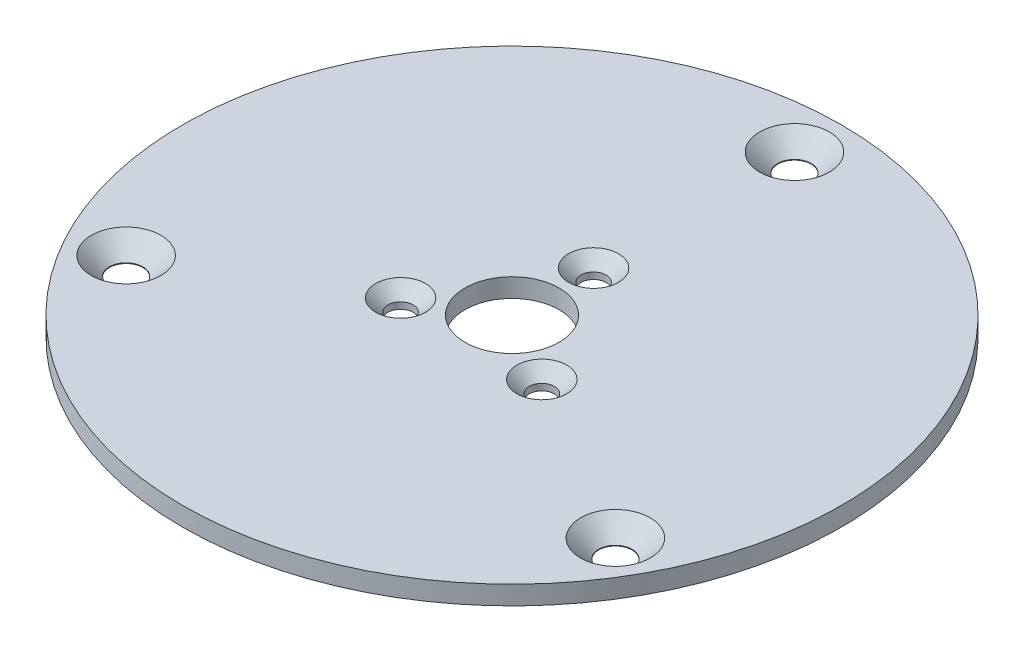
ISO-10303-21;
HEADER;
FILE_DESCRIPTION(('STEP AP214'),'2;1');
FILE_NAME('part.step','',(''),(''),'','','');
FILE_SCHEMA(('AUTOMOTIVE_DESIGN { 1 0 10303 214 1 1 1 1 }'));
ENDSEC;
DATA;
#1=APPLICATION_CONTEXT('core data for automotive mechanical design processes');
#2=APPLICATION_PROTOCOL_DEFINITION('international standard','automotive_design',2000,#1);
#3=PRODUCT_CONTEXT('',#1,'mechanical');
#4=PRODUCT('Part','Part','',(#3));
#5=PRODUCT_RELATED_PRODUCT_CATEGORY('part','',(#4));
#6=PRODUCT_DEFINITION_FORMATION('','',#4);
#7=PRODUCT_DEFINITION_CONTEXT('part definition',#1,'design');
#8=PRODUCT_DEFINITION('design','',#6,#7);
#9=PRODUCT_DEFINITION_SHAPE('','',#8);
#10=(LENGTH_UNIT() NAMED_UNIT(*) SI_UNIT(.MILLI.,.METRE.));
#11=(NAMED_UNIT(*) PLANE_ANGLE_UNIT() SI_UNIT($,.RADIAN.));
#12=(NAMED_UNIT(*) SI_UNIT($,.STERADIAN.) SOLID_ANGLE_UNIT());
#13=UNCERTAINTY_MEASURE_WITH_UNIT(LENGTH_MEASURE(1.E-05),#10,'distance_accuracy_value','');
#14=(GEOMETRIC_REPRESENTATION_CONTEXT(3) GLOBAL_UNCERTAINTY_ASSIGNED_CONTEXT((#13)) GLOBAL_UNIT_ASSIGNED_CONTEXT((#10,
#11,#12)) REPRESENTATION_CONTEXT('',''));
#15=CARTESIAN_POINT('',(0.,0.,0.));
#16=DIRECTION('',(0.,0.,1.));
#17=DIRECTION('',(1.,0.,0.));
#18=AXIS2_PLACEMENT_3D('',#15,#16,#17);
#19=CARTESIAN_POINT('',(0.,2.54,0.));
#20=DIRECTION('',(0.,-1.,0.));
#21=DIRECTION('',(0.,0.,-1.));
#22=AXIS2_PLACEMENT_3D('',#19,#20,#21);
#23=CYLINDRICAL_SURFACE('',#22,44.45);
#24=CARTESIAN_POINT('',(0.,2.54,0.));
#25=DIRECTION('',(0.,1.,0.));
#26=DIRECTION('',(0.,0.,1.));
#27=AXIS2_PLACEMENT_3D('',#24,#25,#26);
#28=CIRCLE('',#27,44.45);
#29=CARTESIAN_POINT('',(0.,2.54,44.45));
#30=VERTEX_POINT('',#29);
#31=EDGE_CURVE('E10',#30,#30,#28,.T.);
#32=ORIENTED_EDGE('',*,*,#31,.F.);
#33=EDGE_LOOP('',(#32));
#34=FACE_BOUND('',#33,.T.);
#35=CARTESIAN_POINT('',(0.,0.,0.));
#36=DIRECTION('',(0.,1.,0.));
#37=DIRECTION('',(0.,0.,1.));
#38=AXIS2_PLACEMENT_3D('',#35,#36,#37);
#39=CIRCLE('',#38,44.45);
#40=CARTESIAN_POINT('',(0.,0.,44.45));
#41=VERTEX_POINT('',#40);
#42=EDGE_CURVE('E39',#41,#41,#39,.T.);
#43=ORIENTED_EDGE('',*,*,#42,.T.);
#44=EDGE_LOOP('',(#43));
#45=FACE_BOUND('',#44,.T.);
#46=ADVANCED_FACE('F36',(#34,#45),#23,.T.);
#47=CARTESIAN_POINT('',(0.,2.54,0.));
#48=DIRECTION('',(0.,1.,0.));
#49=DIRECTION('',(0.,0.,1.));
#50=AXIS2_PLACEMENT_3D('',#47,#48,#49);
#51=PLANE('',#50);
#52=CARTESIAN_POINT('',(0.,2.54,-11.));
#53=DIRECTION('',(0.,1.,0.));
#54=DIRECTION('',(0.,0.,1.));
#55=AXIS2_PLACEMENT_3D('',#52,#53,#54);
#56=CIRCLE('',#55,3.36);
#57=CARTESIAN_POINT('',(0.,2.54,-7.64));
#58=VERTEX_POINT('',#57);
#59=EDGE_CURVE('E120',#58,#58,#56,.T.);
#60=ORIENTED_EDGE('',*,*,#59,.F.);
#61=EDGE_LOOP('',(#60));
#62=FACE_BOUND('',#61,.T.);
#63=CARTESIAN_POINT('',(-9.52627944162882,2.54,5.5));
#64=DIRECTION('',(0.,1.,0.));
#65=DIRECTION('',(0.,0.,1.));
#66=AXIS2_PLACEMENT_3D('',#63,#64,#65);
#67=CIRCLE('',#66,3.36);
#68=CARTESIAN_POINT('',(-9.52627944162882,2.54,8.86));
#69=VERTEX_POINT('',#68);
#70=EDGE_CURVE('E110',#69,#69,#67,.T.);
#71=ORIENTED_EDGE('',*,*,#70,.F.);
#72=EDGE_LOOP('',(#71));
#73=FACE_BOUND('',#72,.T.);
#74=CARTESIAN_POINT('',(9.52627944162882,2.54,5.5));
#75=DIRECTION('',(0.,1.,0.));
#76=DIRECTION('',(0.,0.,1.));
#77=AXIS2_PLACEMENT_3D('',#74,#75,#76);
#78=CIRCLE('',#77,3.36);
#79=CARTESIAN_POINT('',(9.52627944162882,2.54,8.86));
#80=VERTEX_POINT('',#79);
#81=EDGE_CURVE('E98',#80,#80,#78,.T.);
#82=ORIENTED_EDGE('',*,*,#81,.F.);
#83=EDGE_LOOP('',(#82));
#84=FACE_BOUND('',#83,.T.);
#85=CARTESIAN_POINT('',(0.,2.54,0.));
#86=DIRECTION('',(0.,1.,0.));
#87=DIRECTION('',(0.,0.,1.));
#88=AXIS2_PLACEMENT_3D('',#85,#86,#87);
#89=CIRCLE('',#88,6.35);
#90=CARTESIAN_POINT('',(0.,2.54,6.35));
#91=VERTEX_POINT('',#90);
#92=EDGE_CURVE('E83',#91,#91,#89,.T.);
#93=ORIENTED_EDGE('',*,*,#92,.F.);
#94=EDGE_LOOP('',(#93));
#95=FACE_BOUND('',#94,.T.);
#96=CARTESIAN_POINT('',(0.,2.54,-38.1));
#97=DIRECTION('',(0.,1.,0.));
#98=DIRECTION('',(0.,0.,1.));
#99=AXIS2_PLACEMENT_3D('',#96,#97,#98);
#100=CIRCLE('',#99,4.7);
#101=CARTESIAN_POINT('',(0.,2.54,-33.4));
#102=VERTEX_POINT('',#101);
#103=EDGE_CURVE('E79',#102,#102,#100,.T.);
#104=ORIENTED_EDGE('',*,*,#103,.F.);
#105=EDGE_LOOP('',(#104));
#106=FACE_BOUND('',#105,.T.);
#107=CARTESIAN_POINT('',(-32.9955678841873,2.54,19.0499999999997));
#108=DIRECTION('',(0.,1.,0.));
#109=DIRECTION('',(0.,0.,1.));
#110=AXIS2_PLACEMENT_3D('',#107,#108,#109);
#111=CIRCLE('',#110,4.7);
#112=CARTESIAN_POINT('',(-32.9955678841873,2.54,23.7499999999997));
#113=VERTEX_POINT('',#112);
#114=EDGE_CURVE('E69',#113,#113,#111,.T.);
#115=ORIENTED_EDGE('',*,*,#114,.F.);
#116=EDGE_LOOP('',(#115));
#117=FACE_BOUND('',#116,.T.);
#118=CARTESIAN_POINT('',(32.995567884187,2.54,19.0500000000002));
#119=DIRECTION('',(0.,1.,0.));
#120=DIRECTION('',(0.,0.,1.));
#121=AXIS2_PLACEMENT_3D('',#118,#119,#120);
#122=CIRCLE('',#121,4.7);
#123=CARTESIAN_POINT('',(32.995567884187,2.54,23.7500000000001));
#124=VERTEX_POINT('',#123);
#125=EDGE_CURVE('E57',#124,#124,#122,.T.);
#126=ORIENTED_EDGE('',*,*,#125,.F.);
#127=EDGE_LOOP('',(#126));
#128=FACE_BOUND('',#127,.T.);
#129=ORIENTED_EDGE('',*,*,#31,.T.);
#130=EDGE_LOOP('',(#129));
#131=FACE_BOUND('',#130,.T.);
#132=ADVANCED_FACE('F126',(#62,#73,#84,#95,#106,#117,#128,#131),#51,.T.);
#133=CARTESIAN_POINT('',(0.,0.,0.));
#134=DIRECTION('',(0.,1.,0.));
#135=DIRECTION('',(0.,0.,1.));
#136=AXIS2_PLACEMENT_3D('',#133,#134,#135);
#137=PLANE('',#136);
#138=CARTESIAN_POINT('',(0.,0.,-11.));
#139=DIRECTION('',(0.,1.,0.));
#140=DIRECTION('',(0.,0.,1.));
#141=AXIS2_PLACEMENT_3D('',#138,#139,#140);
#142=CIRCLE('',#141,1.7);
#143=CARTESIAN_POINT('',(0.,0.,-9.3));
#144=VERTEX_POINT('',#143);
#145=EDGE_CURVE('E114',#144,#144,#142,.T.);
#146=ORIENTED_EDGE('',*,*,#145,.T.);
#147=EDGE_LOOP('',(#146));
#148=FACE_BOUND('',#147,.T.);
#149=CARTESIAN_POINT('',(-9.52627944162882,0.,5.5));
#150=DIRECTION('',(0.,1.,0.));
#151=DIRECTION('',(0.,0.,1.));
#152=AXIS2_PLACEMENT_3D('',#149,#150,#151);
#153=CIRCLE('',#152,1.7);
#154=CARTESIAN_POINT('',(-9.52627944162882,0.,7.2));
#155=VERTEX_POINT('',#154);
#156=EDGE_CURVE('E102',#155,#155,#153,.T.);
#157=ORIENTED_EDGE('',*,*,#156,.T.);
#158=EDGE_LOOP('',(#157));
#159=FACE_BOUND('',#158,.T.);
#160=CARTESIAN_POINT('',(9.52627944162882,0.,5.5));
#161=DIRECTION('',(0.,1.,0.));
#162=DIRECTION('',(0.,0.,1.));
#163=AXIS2_PLACEMENT_3D('',#160,#161,#162);
#164=CIRCLE('',#163,1.7);
#165=CARTESIAN_POINT('',(9.52627944162882,0.,7.2));
#166=VERTEX_POINT('',#165);
#167=EDGE_CURVE('E87',#166,#166,#164,.T.);
#168=ORIENTED_EDGE('',*,*,#167,.T.);
#169=EDGE_LOOP('',(#168));
#170=FACE_BOUND('',#169,.T.);
#171=CARTESIAN_POINT('',(0.,0.,0.));
#172=DIRECTION('',(0.,1.,0.));
#173=DIRECTION('',(0.,0.,1.));
#174=AXIS2_PLACEMENT_3D('',#171,#172,#173);
#175=CIRCLE('',#174,6.35);
#176=CARTESIAN_POINT('',(0.,0.,6.35));
#177=VERTEX_POINT('',#176);
#178=EDGE_CURVE('E82',#177,#177,#175,.T.);
#179=ORIENTED_EDGE('',*,*,#178,.T.);
#180=EDGE_LOOP('',(#179));
#181=FACE_BOUND('',#180,.T.);
#182=CARTESIAN_POINT('',(0.,0.,-38.1));
#183=DIRECTION('',(0.,1.,0.));
#184=DIRECTION('',(0.,0.,1.));
#185=AXIS2_PLACEMENT_3D('',#182,#183,#184);
#186=CIRCLE('',#185,2.25);
#187=CARTESIAN_POINT('',(0.,0.,-35.85));
#188=VERTEX_POINT('',#187);
#189=EDGE_CURVE('E73',#188,#188,#186,.T.);
#190=ORIENTED_EDGE('',*,*,#189,.T.);
#191=EDGE_LOOP('',(#190));
#192=FACE_BOUND('',#191,.T.);
#193=CARTESIAN_POINT('',(-32.9955678841873,0.,19.0499999999997));
#194=DIRECTION('',(0.,1.,0.));
#195=DIRECTION('',(0.,0.,1.));
#196=AXIS2_PLACEMENT_3D('',#193,#194,#195);
#197=CIRCLE('',#196,2.25);
#198=CARTESIAN_POINT('',(-32.9955678841873,0.,21.2999999999997));
#199=VERTEX_POINT('',#198);
#200=EDGE_CURVE('E61',#199,#199,#197,.T.);
#201=ORIENTED_EDGE('',*,*,#200,.T.);
#202=EDGE_LOOP('',(#201));
#203=FACE_BOUND('',#202,.T.);
#204=CARTESIAN_POINT('',(32.995567884187,0.,19.0500000000002));
#205=DIRECTION('',(0.,1.,0.));
#206=DIRECTION('',(0.,0.,1.));
#207=AXIS2_PLACEMENT_3D('',#204,#205,#206);
#208=CIRCLE('',#207,2.25);
#209=CARTESIAN_POINT('',(32.995567884187,0.,21.3000000000002));
#210=VERTEX_POINT('',#209);
#211=EDGE_CURVE('E48',#210,#210,#208,.T.);
#212=ORIENTED_EDGE('',*,*,#211,.T.);
#213=EDGE_LOOP('',(#212));
#214=FACE_BOUND('',#213,.T.);
#215=ORIENTED_EDGE('',*,*,#42,.F.);
#216=EDGE_LOOP('',(#215));
#217=FACE_BOUND('',#216,.T.);
#218=ADVANCED_FACE('F129',(#148,#159,#170,#181,#192,#203,#214,#217),#137,.F.);
#219=CARTESIAN_POINT('',(32.995567884187,2.54,19.0500000000002));
#220=DIRECTION('',(0.,1.,0.));
#221=DIRECTION('',(0.,0.,1.));
#222=AXIS2_PLACEMENT_3D('',#219,#220,#221);
#223=CYLINDRICAL_SURFACE('',#222,2.25);
#224=ORIENTED_EDGE('',*,*,#211,.F.);
#225=EDGE_LOOP('',(#224));
#226=FACE_BOUND('',#225,.T.);
#227=CARTESIAN_POINT('',(32.995567884187,0.0900000000000002,19.0500000000002));
#228=DIRECTION('',(0.,1.,0.));
#229=DIRECTION('',(0.,0.,1.));
#230=AXIS2_PLACEMENT_3D('',#227,#228,#229);
#231=CIRCLE('',#230,2.25);
#232=CARTESIAN_POINT('',(32.995567884187,0.0900000000000002,21.3000000000002));
#233=VERTEX_POINT('',#232);
#234=EDGE_CURVE('E53',#233,#233,#231,.T.);
#235=ORIENTED_EDGE('',*,*,#234,.T.);
#236=EDGE_LOOP('',(#235));
#237=FACE_BOUND('',#236,.T.);
#238=ADVANCED_FACE('F146',(#226,#237),#223,.F.);
#239=CARTESIAN_POINT('',(32.995567884187,2.54,19.0500000000002));
#240=DIRECTION('',(0.,1.,0.));
#241=DIRECTION('',(0.,0.,1.));
#242=AXIS2_PLACEMENT_3D('',#239,#240,#241);
#243=CONICAL_SURFACE('',#242,4.7,0.785398163397447);
#244=ORIENTED_EDGE('',*,*,#234,.F.);
#245=EDGE_LOOP('',(#244));
#246=FACE_BOUND('',#245,.T.);
#247=ORIENTED_EDGE('',*,*,#125,.T.);
#248=EDGE_LOOP('',(#247));
#249=FACE_BOUND('',#248,.T.);
#250=ADVANCED_FACE('F143',(#246,#249),#243,.F.);
#251=CARTESIAN_POINT('',(-32.9955678841873,2.54,19.0499999999997));
#252=DIRECTION('',(0.,1.,0.));
#253=DIRECTION('',(0.,0.,1.));
#254=AXIS2_PLACEMENT_3D('',#251,#252,#253);
#255=CYLINDRICAL_SURFACE('',#254,2.25);
#256=ORIENTED_EDGE('',*,*,#200,.F.);
#257=EDGE_LOOP('',(#256));
#258=FACE_BOUND('',#257,.T.);
#259=CARTESIAN_POINT('',(-32.9955678841873,0.0900000000000002,19.0499999999997));
#260=DIRECTION('',(0.,1.,0.));
#261=DIRECTION('',(0.,0.,1.));
#262=AXIS2_PLACEMENT_3D('',#259,#260,#261);
#263=CIRCLE('',#262,2.25);
#264=CARTESIAN_POINT('',(-32.9955678841873,0.0900000000000002,21.2999999999997));
#265=VERTEX_POINT('',#264);
#266=EDGE_CURVE('E65',#265,#265,#263,.T.);
#267=ORIENTED_EDGE('',*,*,#266,.T.);
#268=EDGE_LOOP('',(#267));
#269=FACE_BOUND('',#268,.T.);
#270=ADVANCED_FACE('F145',(#258,#269),#255,.F.);
#271=CARTESIAN_POINT('',(-32.9955678841873,2.54,19.0499999999997));
#272=DIRECTION('',(0.,1.,0.));
#273=DIRECTION('',(0.,0.,1.));
#274=AXIS2_PLACEMENT_3D('',#271,#272,#273);
#275=CONICAL_SURFACE('',#274,4.7,0.785398163397448);
#276=ORIENTED_EDGE('',*,*,#266,.F.);
#277=EDGE_LOOP('',(#276));
#278=FACE_BOUND('',#277,.T.);
#279=ORIENTED_EDGE('',*,*,#114,.T.);
#280=EDGE_LOOP('',(#279));
#281=FACE_BOUND('',#280,.T.);
#282=ADVANCED_FACE('F153',(#278,#281),#275,.F.);
#283=CARTESIAN_POINT('',(0.,2.54,-38.1));
#284=DIRECTION('',(0.,1.,0.));
#285=DIRECTION('',(0.,0.,1.));
#286=AXIS2_PLACEMENT_3D('',#283,#284,#285);
#287=CYLINDRICAL_SURFACE('',#286,2.25);
#288=ORIENTED_EDGE('',*,*,#189,.F.);
#289=EDGE_LOOP('',(#288));
#290=FACE_BOUND('',#289,.T.);
#291=CARTESIAN_POINT('',(0.,0.0900000000000002,-38.1));
#292=DIRECTION('',(0.,1.,0.));
#293=DIRECTION('',(0.,0.,1.));
#294=AXIS2_PLACEMENT_3D('',#291,#292,#293);
#295=CIRCLE('',#294,2.25);
#296=CARTESIAN_POINT('',(0.,0.0900000000000002,-35.85));
#297=VERTEX_POINT('',#296);
#298=EDGE_CURVE('E76',#297,#297,#295,.T.);
#299=ORIENTED_EDGE('',*,*,#298,.T.);
#300=EDGE_LOOP('',(#299));
#301=FACE_BOUND('',#300,.T.);
#302=ADVANCED_FACE('F188',(#290,#301),#287,.F.);
#303=CARTESIAN_POINT('',(0.,2.54,-38.1));
#304=DIRECTION('',(0.,1.,0.));
#305=DIRECTION('',(0.,0.,1.));
#306=AXIS2_PLACEMENT_3D('',#303,#304,#305);
#307=CONICAL_SURFACE('',#306,4.7,0.785398163397448);
#308=ORIENTED_EDGE('',*,*,#298,.F.);
#309=EDGE_LOOP('',(#308));
#310=FACE_BOUND('',#309,.T.);
#311=ORIENTED_EDGE('',*,*,#103,.T.);
#312=EDGE_LOOP('',(#311));
#313=FACE_BOUND('',#312,.T.);
#314=ADVANCED_FACE('F193',(#310,#313),#307,.F.);
#315=CARTESIAN_POINT('',(0.,0.,0.));
#316=DIRECTION('',(0.,1.,0.));
#317=DIRECTION('',(0.,0.,1.));
#318=AXIS2_PLACEMENT_3D('',#315,#316,#317);
#319=CYLINDRICAL_SURFACE('',#318,6.35);
#320=ORIENTED_EDGE('',*,*,#178,.F.);
#321=EDGE_LOOP('',(#320));
#322=FACE_BOUND('',#321,.T.);
#323=ORIENTED_EDGE('',*,*,#92,.T.);
#324=EDGE_LOOP('',(#323));
#325=FACE_BOUND('',#324,.T.);
#326=ADVANCED_FACE('F199',(#322,#325),#319,.F.);
#327=CARTESIAN_POINT('',(9.52627944162882,2.54,5.5));
#328=DIRECTION('',(0.,1.,0.));
#329=DIRECTION('',(0.,0.,1.));
#330=AXIS2_PLACEMENT_3D('',#327,#328,#329);
#331=CYLINDRICAL_SURFACE('',#330,1.7);
#332=ORIENTED_EDGE('',*,*,#167,.F.);
#333=EDGE_LOOP('',(#332));
#334=FACE_BOUND('',#333,.T.);
#335=CARTESIAN_POINT('',(9.52627944162882,0.88,5.5));
#336=DIRECTION('',(0.,1.,0.));
#337=DIRECTION('',(0.,0.,1.));
#338=AXIS2_PLACEMENT_3D('',#335,#336,#337);
#339=CIRCLE('',#338,1.7);
#340=CARTESIAN_POINT('',(9.52627944162882,0.88,7.2));
#341=VERTEX_POINT('',#340);
#342=EDGE_CURVE('E94',#341,#341,#339,.T.);
#343=ORIENTED_EDGE('',*,*,#342,.T.);
#344=EDGE_LOOP('',(#343));
#345=FACE_BOUND('',#344,.T.);
#346=ADVANCED_FACE('F203',(#334,#345),#331,.F.);
#347=CARTESIAN_POINT('',(9.52627944162882,2.54,5.5));
#348=DIRECTION('',(0.,1.,0.));
#349=DIRECTION('',(0.,0.,1.));
#350=AXIS2_PLACEMENT_3D('',#347,#348,#349);
#351=CONICAL_SURFACE('',#350,3.36,0.785398163397449);
#352=ORIENTED_EDGE('',*,*,#342,.F.);
#353=EDGE_LOOP('',(#352));
#354=FACE_BOUND('',#353,.T.);
#355=ORIENTED_EDGE('',*,*,#81,.T.);
#356=EDGE_LOOP('',(#355));
#357=FACE_BOUND('',#356,.T.);
#358=ADVANCED_FACE('F207',(#354,#357),#351,.F.);
#359=CARTESIAN_POINT('',(-9.52627944162882,2.54,5.5));
#360=DIRECTION('',(0.,1.,0.));
#361=DIRECTION('',(0.,0.,1.));
#362=AXIS2_PLACEMENT_3D('',#359,#360,#361);
#363=CYLINDRICAL_SURFACE('',#362,1.7);
#364=ORIENTED_EDGE('',*,*,#156,.F.);
#365=EDGE_LOOP('',(#364));
#366=FACE_BOUND('',#365,.T.);
#367=CARTESIAN_POINT('',(-9.52627944162882,0.88,5.5));
#368=DIRECTION('',(0.,1.,0.));
#369=DIRECTION('',(0.,0.,1.));
#370=AXIS2_PLACEMENT_3D('',#367,#368,#369);
#371=CIRCLE('',#370,1.7);
#372=CARTESIAN_POINT('',(-9.52627944162882,0.88,7.2));
#373=VERTEX_POINT('',#372);
#374=EDGE_CURVE('E106',#373,#373,#371,.T.);
#375=ORIENTED_EDGE('',*,*,#374,.T.);
#376=EDGE_LOOP('',(#375));
#377=FACE_BOUND('',#376,.T.);
#378=ADVANCED_FACE('F210',(#366,#377),#363,.F.);
#379=CARTESIAN_POINT('',(-9.52627944162882,2.54,5.5));
#380=DIRECTION('',(0.,1.,0.));
#381=DIRECTION('',(0.,0.,1.));
#382=AXIS2_PLACEMENT_3D('',#379,#380,#381);
#383=CONICAL_SURFACE('',#382,3.36,0.785398163397449);
#384=ORIENTED_EDGE('',*,*,#374,.F.);
#385=EDGE_LOOP('',(#384));
#386=FACE_BOUND('',#385,.T.);
#387=ORIENTED_EDGE('',*,*,#70,.T.);
#388=EDGE_LOOP('',(#387));
#389=FACE_BOUND('',#388,.T.);
#390=ADVANCED_FACE('F214',(#386,#389),#383,.F.);
#391=CARTESIAN_POINT('',(0.,2.54,-11.));
#392=DIRECTION('',(0.,1.,0.));
#393=DIRECTION('',(0.,0.,1.));
#394=AXIS2_PLACEMENT_3D('',#391,#392,#393);
#395=CYLINDRICAL_SURFACE('',#394,1.7);
#396=ORIENTED_EDGE('',*,*,#145,.F.);
#397=EDGE_LOOP('',(#396));
#398=FACE_BOUND('',#397,.T.);
#399=CARTESIAN_POINT('',(0.,0.88,-11.));
#400=DIRECTION('',(0.,1.,0.));
#401=DIRECTION('',(0.,0.,1.));
#402=AXIS2_PLACEMENT_3D('',#399,#400,#401);
#403=CIRCLE('',#402,1.7);
#404=CARTESIAN_POINT('',(0.,0.88,-9.3));
#405=VERTEX_POINT('',#404);
#406=EDGE_CURVE('E117',#405,#405,#403,.T.);
#407=ORIENTED_EDGE('',*,*,#406,.T.);
#408=EDGE_LOOP('',(#407));
#409=FACE_BOUND('',#408,.T.);
#410=ADVANCED_FACE('F218',(#398,#409),#395,.F.);
#411=CARTESIAN_POINT('',(0.,2.54,-11.));
#412=DIRECTION('',(0.,1.,0.));
#413=DIRECTION('',(0.,0.,1.));
#414=AXIS2_PLACEMENT_3D('',#411,#412,#413);
#415=CONICAL_SURFACE('',#414,3.36,0.785398163397449);
#416=ORIENTED_EDGE('',*,*,#406,.F.);
#417=EDGE_LOOP('',(#416));
#418=FACE_BOUND('',#417,.T.);
#419=ORIENTED_EDGE('',*,*,#59,.T.);
#420=EDGE_LOOP('',(#419));
#421=FACE_BOUND('',#420,.T.);
#422=ADVANCED_FACE('F124',(#418,#421),#415,.F.);
#423=CLOSED_SHELL('',(#46,#132,#218,#238,#250,#270,#282,#302,#314,#326,#346,#358,#378,#390,#410,#422));
#424=MANIFOLD_SOLID_BREP('B2',#423);
#425=ADVANCED_BREP_SHAPE_REPRESENTATION('',(#18,#424),#14);
#426=SHAPE_DEFINITION_REPRESENTATION(#9,#425);
ENDSEC;
END-ISO-10303-21;
